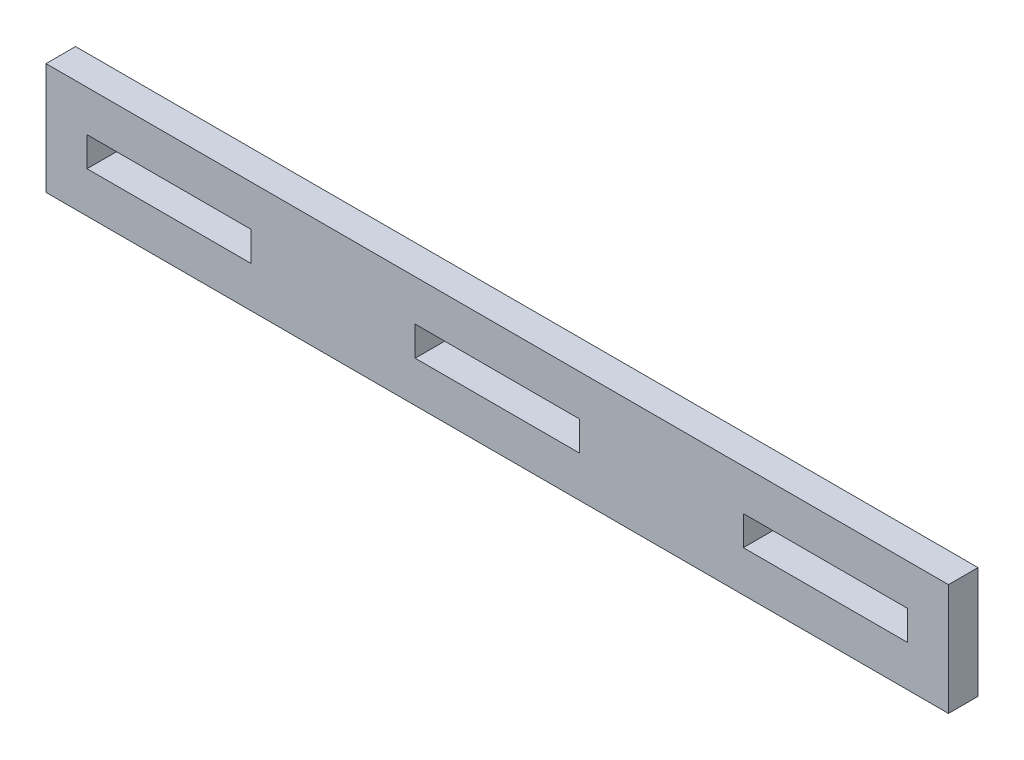
ISO-10303-21;
HEADER;
FILE_DESCRIPTION(('STEP AP214'),'2;1');
FILE_NAME('part.step','',(''),(''),'','','');
FILE_SCHEMA(('AUTOMOTIVE_DESIGN { 1 0 10303 214 1 1 1 1 }'));
ENDSEC;
DATA;
#1=APPLICATION_CONTEXT('core data for automotive mechanical design processes');
#2=APPLICATION_PROTOCOL_DEFINITION('international standard','automotive_design',2000,#1);
#3=PRODUCT_CONTEXT('',#1,'mechanical');
#4=PRODUCT('Part','Part','',(#3));
#5=PRODUCT_RELATED_PRODUCT_CATEGORY('part','',(#4));
#6=PRODUCT_DEFINITION_FORMATION('','',#4);
#7=PRODUCT_DEFINITION_CONTEXT('part definition',#1,'design');
#8=PRODUCT_DEFINITION('design','',#6,#7);
#9=PRODUCT_DEFINITION_SHAPE('','',#8);
#10=(LENGTH_UNIT() NAMED_UNIT(*) SI_UNIT(.MILLI.,.METRE.));
#11=(NAMED_UNIT(*) PLANE_ANGLE_UNIT() SI_UNIT($,.RADIAN.));
#12=(NAMED_UNIT(*) SI_UNIT($,.STERADIAN.) SOLID_ANGLE_UNIT());
#13=UNCERTAINTY_MEASURE_WITH_UNIT(LENGTH_MEASURE(1.E-05),#10,'distance_accuracy_value','');
#14=(GEOMETRIC_REPRESENTATION_CONTEXT(3) GLOBAL_UNCERTAINTY_ASSIGNED_CONTEXT((#13)) GLOBAL_UNIT_ASSIGNED_CONTEXT((#10,
#11,#12)) REPRESENTATION_CONTEXT('',''));
#15=CARTESIAN_POINT('',(0.,0.,0.));
#16=DIRECTION('',(0.,0.,1.));
#17=DIRECTION('',(1.,0.,0.));
#18=AXIS2_PLACEMENT_3D('',#15,#16,#17);
#19=CARTESIAN_POINT('',(0.,0.,4.572));
#20=DIRECTION('',(1.,0.,0.));
#21=DIRECTION('',(0.,0.,-1.));
#22=AXIS2_PLACEMENT_3D('',#19,#20,#21);
#23=PLANE('',#22);
#24=DIRECTION('',(0.,-1.,0.));
#25=VECTOR('',#24,1.);
#26=CARTESIAN_POINT('',(0.,0.,0.));
#27=LINE('',#26,#25);
#28=CARTESIAN_POINT('',(0.,17.272,0.));
#29=VERTEX_POINT('',#28);
#30=CARTESIAN_POINT('',(0.,0.,0.));
#31=VERTEX_POINT('',#30);
#32=EDGE_CURVE('E182',#29,#31,#27,.T.);
#33=ORIENTED_EDGE('',*,*,#32,.T.);
#34=DIRECTION('',(0.,0.,-1.));
#35=VECTOR('',#34,1.);
#36=CARTESIAN_POINT('',(0.,0.,4.572));
#37=LINE('',#36,#35);
#38=CARTESIAN_POINT('',(0.,0.,4.572));
#39=VERTEX_POINT('',#38);
#40=EDGE_CURVE('E11',#39,#31,#37,.T.);
#41=ORIENTED_EDGE('',*,*,#40,.F.);
#42=DIRECTION('',(0.,-1.,0.));
#43=VECTOR('',#42,1.);
#44=CARTESIAN_POINT('',(0.,0.,4.572));
#45=LINE('',#44,#43);
#46=CARTESIAN_POINT('',(0.,17.272,4.572));
#47=VERTEX_POINT('',#46);
#48=EDGE_CURVE('E247',#47,#39,#45,.T.);
#49=ORIENTED_EDGE('',*,*,#48,.F.);
#50=DIRECTION('',(0.,0.,-1.));
#51=VECTOR('',#50,1.);
#52=CARTESIAN_POINT('',(0.,17.272,4.572));
#53=LINE('',#52,#51);
#54=EDGE_CURVE('E257',#47,#29,#53,.T.);
#55=ORIENTED_EDGE('',*,*,#54,.T.);
#56=EDGE_LOOP('',(#33,#41,#49,#55));
#57=FACE_BOUND('',#56,.T.);
#58=ADVANCED_FACE('F33',(#57),#23,.F.);
#59=CARTESIAN_POINT('',(0.,0.,4.572));
#60=DIRECTION('',(0.,1.,0.));
#61=DIRECTION('',(0.,0.,1.));
#62=AXIS2_PLACEMENT_3D('',#59,#60,#61);
#63=PLANE('',#62);
#64=DIRECTION('',(1.,0.,0.));
#65=VECTOR('',#64,1.);
#66=CARTESIAN_POINT('',(0.,0.,0.));
#67=LINE('',#66,#65);
#68=CARTESIAN_POINT('',(139.7,0.,0.));
#69=VERTEX_POINT('',#68);
#70=EDGE_CURVE('E260',#31,#69,#67,.T.);
#71=ORIENTED_EDGE('',*,*,#70,.T.);
#72=DIRECTION('',(0.,0.,-1.));
#73=VECTOR('',#72,1.);
#74=CARTESIAN_POINT('',(139.7,0.,4.572));
#75=LINE('',#74,#73);
#76=CARTESIAN_POINT('',(139.7,0.,4.572));
#77=VERTEX_POINT('',#76);
#78=EDGE_CURVE('E40',#77,#69,#75,.T.);
#79=ORIENTED_EDGE('',*,*,#78,.F.);
#80=DIRECTION('',(1.,0.,0.));
#81=VECTOR('',#80,1.);
#82=CARTESIAN_POINT('',(0.,0.,4.572));
#83=LINE('',#82,#81);
#84=EDGE_CURVE('E250',#39,#77,#83,.T.);
#85=ORIENTED_EDGE('',*,*,#84,.F.);
#86=ORIENTED_EDGE('',*,*,#40,.T.);
#87=EDGE_LOOP('',(#71,#79,#85,#86));
#88=FACE_BOUND('',#87,.T.);
#89=ADVANCED_FACE('F289',(#88),#63,.F.);
#90=CARTESIAN_POINT('',(139.7,0.,4.572));
#91=DIRECTION('',(-1.,0.,0.));
#92=DIRECTION('',(0.,0.,1.));
#93=AXIS2_PLACEMENT_3D('',#90,#91,#92);
#94=PLANE('',#93);
#95=DIRECTION('',(0.,1.,0.));
#96=VECTOR('',#95,1.);
#97=CARTESIAN_POINT('',(139.7,0.,0.));
#98=LINE('',#97,#96);
#99=CARTESIAN_POINT('',(139.7,17.272,0.));
#100=VERTEX_POINT('',#99);
#101=EDGE_CURVE('E262',#69,#100,#98,.T.);
#102=ORIENTED_EDGE('',*,*,#101,.T.);
#103=DIRECTION('',(0.,0.,-1.));
#104=VECTOR('',#103,1.);
#105=CARTESIAN_POINT('',(139.7,17.272,4.572));
#106=LINE('',#105,#104);
#107=CARTESIAN_POINT('',(139.7,17.272,4.572));
#108=VERTEX_POINT('',#107);
#109=EDGE_CURVE('E267',#108,#100,#106,.T.);
#110=ORIENTED_EDGE('',*,*,#109,.F.);
#111=DIRECTION('',(0.,1.,0.));
#112=VECTOR('',#111,1.);
#113=CARTESIAN_POINT('',(139.7,0.,4.572));
#114=LINE('',#113,#112);
#115=EDGE_CURVE('E253',#77,#108,#114,.T.);
#116=ORIENTED_EDGE('',*,*,#115,.F.);
#117=ORIENTED_EDGE('',*,*,#78,.T.);
#118=EDGE_LOOP('',(#102,#110,#116,#117));
#119=FACE_BOUND('',#118,.T.);
#120=ADVANCED_FACE('F274',(#119),#94,.F.);
#121=CARTESIAN_POINT('',(0.,17.272,4.572));
#122=DIRECTION('',(0.,-1.,0.));
#123=DIRECTION('',(0.,0.,-1.));
#124=AXIS2_PLACEMENT_3D('',#121,#122,#123);
#125=PLANE('',#124);
#126=DIRECTION('',(-1.,0.,0.));
#127=VECTOR('',#126,1.);
#128=CARTESIAN_POINT('',(0.,17.272,0.));
#129=LINE('',#128,#127);
#130=EDGE_CURVE('E251',#100,#29,#129,.T.);
#131=ORIENTED_EDGE('',*,*,#130,.T.);
#132=ORIENTED_EDGE('',*,*,#54,.F.);
#133=DIRECTION('',(-1.,0.,0.));
#134=VECTOR('',#133,1.);
#135=CARTESIAN_POINT('',(0.,17.272,4.572));
#136=LINE('',#135,#134);
#137=EDGE_CURVE('E255',#108,#47,#136,.T.);
#138=ORIENTED_EDGE('',*,*,#137,.F.);
#139=ORIENTED_EDGE('',*,*,#109,.T.);
#140=EDGE_LOOP('',(#131,#132,#138,#139));
#141=FACE_BOUND('',#140,.T.);
#142=ADVANCED_FACE('F282',(#141),#125,.F.);
#143=CARTESIAN_POINT('',(0.,0.,4.572));
#144=DIRECTION('',(0.,0.,-1.));
#145=DIRECTION('',(-1.,0.,0.));
#146=AXIS2_PLACEMENT_3D('',#143,#144,#145);
#147=PLANE('',#146);
#148=DIRECTION('',(1.,0.,0.));
#149=VECTOR('',#148,1.);
#150=CARTESIAN_POINT('',(107.95,6.35,4.572));
#151=LINE('',#150,#149);
#152=CARTESIAN_POINT('',(107.95,6.35,4.572));
#153=VERTEX_POINT('',#152);
#154=CARTESIAN_POINT('',(133.35,6.35,4.572));
#155=VERTEX_POINT('',#154);
#156=EDGE_CURVE('E175',#153,#155,#151,.T.);
#157=ORIENTED_EDGE('',*,*,#156,.F.);
#158=DIRECTION('',(0.,-1.,0.));
#159=VECTOR('',#158,1.);
#160=CARTESIAN_POINT('',(107.95,10.922,4.572));
#161=LINE('',#160,#159);
#162=CARTESIAN_POINT('',(107.95,10.922,4.572));
#163=VERTEX_POINT('',#162);
#164=EDGE_CURVE('E47',#163,#153,#161,.T.);
#165=ORIENTED_EDGE('',*,*,#164,.F.);
#166=DIRECTION('',(-1.,0.,0.));
#167=VECTOR('',#166,1.);
#168=CARTESIAN_POINT('',(107.95,10.922,4.572));
#169=LINE('',#168,#167);
#170=CARTESIAN_POINT('',(133.35,10.922,4.572));
#171=VERTEX_POINT('',#170);
#172=EDGE_CURVE('E166',#171,#163,#169,.T.);
#173=ORIENTED_EDGE('',*,*,#172,.F.);
#174=DIRECTION('',(0.,1.,0.));
#175=VECTOR('',#174,1.);
#176=CARTESIAN_POINT('',(133.35,10.922,4.572));
#177=LINE('',#176,#175);
#178=EDGE_CURVE('E169',#155,#171,#177,.T.);
#179=ORIENTED_EDGE('',*,*,#178,.F.);
#180=EDGE_LOOP('',(#157,#165,#173,#179));
#181=FACE_BOUND('',#180,.T.);
#182=DIRECTION('',(-1.,0.,0.));
#183=VECTOR('',#182,1.);
#184=CARTESIAN_POINT('',(82.55,10.922,4.572));
#185=LINE('',#184,#183);
#186=CARTESIAN_POINT('',(82.55,10.922,4.572));
#187=VERTEX_POINT('',#186);
#188=CARTESIAN_POINT('',(57.15,10.922,4.572));
#189=VERTEX_POINT('',#188);
#190=EDGE_CURVE('E201',#187,#189,#185,.T.);
#191=ORIENTED_EDGE('',*,*,#190,.F.);
#192=DIRECTION('',(0.,1.,0.));
#193=VECTOR('',#192,1.);
#194=CARTESIAN_POINT('',(82.55,10.922,4.572));
#195=LINE('',#194,#193);
#196=CARTESIAN_POINT('',(82.55,6.35,4.572));
#197=VERTEX_POINT('',#196);
#198=EDGE_CURVE('E55',#197,#187,#195,.T.);
#199=ORIENTED_EDGE('',*,*,#198,.F.);
#200=DIRECTION('',(1.,0.,0.));
#201=VECTOR('',#200,1.);
#202=CARTESIAN_POINT('',(82.55,6.35,4.572));
#203=LINE('',#202,#201);
#204=CARTESIAN_POINT('',(57.15,6.34999999999999,4.572));
#205=VERTEX_POINT('',#204);
#206=EDGE_CURVE('E190',#205,#197,#203,.T.);
#207=ORIENTED_EDGE('',*,*,#206,.F.);
#208=DIRECTION('',(0.,-1.,0.));
#209=VECTOR('',#208,1.);
#210=CARTESIAN_POINT('',(57.15,10.922,4.572));
#211=LINE('',#210,#209);
#212=EDGE_CURVE('E205',#189,#205,#211,.T.);
#213=ORIENTED_EDGE('',*,*,#212,.F.);
#214=EDGE_LOOP('',(#191,#199,#207,#213));
#215=FACE_BOUND('',#214,.T.);
#216=DIRECTION('',(-1.,0.,0.));
#217=VECTOR('',#216,1.);
#218=CARTESIAN_POINT('',(31.75,10.922,4.572));
#219=LINE('',#218,#217);
#220=CARTESIAN_POINT('',(31.75,10.922,4.572));
#221=VERTEX_POINT('',#220);
#222=CARTESIAN_POINT('',(6.34999999999999,10.922,4.572));
#223=VERTEX_POINT('',#222);
#224=EDGE_CURVE('E232',#221,#223,#219,.T.);
#225=ORIENTED_EDGE('',*,*,#224,.F.);
#226=DIRECTION('',(0.,1.,0.));
#227=VECTOR('',#226,1.);
#228=CARTESIAN_POINT('',(31.75,10.922,4.572));
#229=LINE('',#228,#227);
#230=CARTESIAN_POINT('',(31.75,6.35,4.572));
#231=VERTEX_POINT('',#230);
#232=EDGE_CURVE('E230',#231,#221,#229,.T.);
#233=ORIENTED_EDGE('',*,*,#232,.F.);
#234=DIRECTION('',(1.,0.,0.));
#235=VECTOR('',#234,1.);
#236=CARTESIAN_POINT('',(31.75,6.35,4.572));
#237=LINE('',#236,#235);
#238=CARTESIAN_POINT('',(6.34999999999999,6.35,4.572));
#239=VERTEX_POINT('',#238);
#240=EDGE_CURVE('E220',#239,#231,#237,.T.);
#241=ORIENTED_EDGE('',*,*,#240,.F.);
#242=DIRECTION('',(0.,-1.,0.));
#243=VECTOR('',#242,1.);
#244=CARTESIAN_POINT('',(6.34999999999999,10.922,4.572));
#245=LINE('',#244,#243);
#246=EDGE_CURVE('E235',#223,#239,#245,.T.);
#247=ORIENTED_EDGE('',*,*,#246,.F.);
#248=EDGE_LOOP('',(#225,#233,#241,#247));
#249=FACE_BOUND('',#248,.T.);
#250=ORIENTED_EDGE('',*,*,#48,.T.);
#251=ORIENTED_EDGE('',*,*,#84,.T.);
#252=ORIENTED_EDGE('',*,*,#115,.T.);
#253=ORIENTED_EDGE('',*,*,#137,.T.);
#254=EDGE_LOOP('',(#250,#251,#252,#253));
#255=FACE_BOUND('',#254,.T.);
#256=ADVANCED_FACE('F288',(#181,#215,#249,#255),#147,.F.);
#257=CARTESIAN_POINT('',(0.,0.,0.));
#258=DIRECTION('',(0.,0.,-1.));
#259=DIRECTION('',(-1.,0.,0.));
#260=AXIS2_PLACEMENT_3D('',#257,#258,#259);
#261=PLANE('',#260);
#262=DIRECTION('',(0.,-1.,0.));
#263=VECTOR('',#262,1.);
#264=CARTESIAN_POINT('',(107.95,10.922,0.));
#265=LINE('',#264,#263);
#266=CARTESIAN_POINT('',(107.95,10.922,0.));
#267=VERTEX_POINT('',#266);
#268=CARTESIAN_POINT('',(107.95,6.35,0.));
#269=VERTEX_POINT('',#268);
#270=EDGE_CURVE('E147',#267,#269,#265,.T.);
#271=ORIENTED_EDGE('',*,*,#270,.T.);
#272=DIRECTION('',(1.,0.,0.));
#273=VECTOR('',#272,1.);
#274=CARTESIAN_POINT('',(107.95,6.35,0.));
#275=LINE('',#274,#273);
#276=CARTESIAN_POINT('',(133.35,6.35,0.));
#277=VERTEX_POINT('',#276);
#278=EDGE_CURVE('E157',#269,#277,#275,.T.);
#279=ORIENTED_EDGE('',*,*,#278,.T.);
#280=DIRECTION('',(0.,1.,0.));
#281=VECTOR('',#280,1.);
#282=CARTESIAN_POINT('',(133.35,10.922,0.));
#283=LINE('',#282,#281);
#284=CARTESIAN_POINT('',(133.35,10.922,0.));
#285=VERTEX_POINT('',#284);
#286=EDGE_CURVE('E161',#277,#285,#283,.T.);
#287=ORIENTED_EDGE('',*,*,#286,.T.);
#288=DIRECTION('',(-1.,0.,0.));
#289=VECTOR('',#288,1.);
#290=CARTESIAN_POINT('',(107.95,10.922,0.));
#291=LINE('',#290,#289);
#292=EDGE_CURVE('E153',#285,#267,#291,.T.);
#293=ORIENTED_EDGE('',*,*,#292,.T.);
#294=EDGE_LOOP('',(#271,#279,#287,#293));
#295=FACE_BOUND('',#294,.T.);
#296=DIRECTION('',(0.,1.,0.));
#297=VECTOR('',#296,1.);
#298=CARTESIAN_POINT('',(82.55,10.922,0.));
#299=LINE('',#298,#297);
#300=CARTESIAN_POINT('',(82.55,6.35,0.));
#301=VERTEX_POINT('',#300);
#302=CARTESIAN_POINT('',(82.55,10.922,0.));
#303=VERTEX_POINT('',#302);
#304=EDGE_CURVE('E186',#301,#303,#299,.T.);
#305=ORIENTED_EDGE('',*,*,#304,.T.);
#306=DIRECTION('',(-1.,0.,0.));
#307=VECTOR('',#306,1.);
#308=CARTESIAN_POINT('',(82.55,10.922,0.));
#309=LINE('',#308,#307);
#310=CARTESIAN_POINT('',(57.15,10.922,0.));
#311=VERTEX_POINT('',#310);
#312=EDGE_CURVE('E189',#303,#311,#309,.T.);
#313=ORIENTED_EDGE('',*,*,#312,.T.);
#314=DIRECTION('',(0.,-1.,0.));
#315=VECTOR('',#314,1.);
#316=CARTESIAN_POINT('',(57.15,10.922,0.));
#317=LINE('',#316,#315);
#318=CARTESIAN_POINT('',(57.15,6.34999999999999,0.));
#319=VERTEX_POINT('',#318);
#320=EDGE_CURVE('E193',#311,#319,#317,.T.);
#321=ORIENTED_EDGE('',*,*,#320,.T.);
#322=DIRECTION('',(1.,0.,0.));
#323=VECTOR('',#322,1.);
#324=CARTESIAN_POINT('',(82.55,6.35,0.));
#325=LINE('',#324,#323);
#326=EDGE_CURVE('E196',#319,#301,#325,.T.);
#327=ORIENTED_EDGE('',*,*,#326,.T.);
#328=EDGE_LOOP('',(#305,#313,#321,#327));
#329=FACE_BOUND('',#328,.T.);
#330=DIRECTION('',(0.,1.,0.));
#331=VECTOR('',#330,1.);
#332=CARTESIAN_POINT('',(31.75,10.922,0.));
#333=LINE('',#332,#331);
#334=CARTESIAN_POINT('',(31.75,6.35,0.));
#335=VERTEX_POINT('',#334);
#336=CARTESIAN_POINT('',(31.75,10.922,0.));
#337=VERTEX_POINT('',#336);
#338=EDGE_CURVE('E216',#335,#337,#333,.T.);
#339=ORIENTED_EDGE('',*,*,#338,.T.);
#340=DIRECTION('',(-1.,0.,0.));
#341=VECTOR('',#340,1.);
#342=CARTESIAN_POINT('',(31.75,10.922,0.));
#343=LINE('',#342,#341);
#344=CARTESIAN_POINT('',(6.34999999999999,10.922,0.));
#345=VERTEX_POINT('',#344);
#346=EDGE_CURVE('E219',#337,#345,#343,.T.);
#347=ORIENTED_EDGE('',*,*,#346,.T.);
#348=DIRECTION('',(0.,-1.,0.));
#349=VECTOR('',#348,1.);
#350=CARTESIAN_POINT('',(6.34999999999999,10.922,0.));
#351=LINE('',#350,#349);
#352=CARTESIAN_POINT('',(6.34999999999999,6.35,0.));
#353=VERTEX_POINT('',#352);
#354=EDGE_CURVE('E223',#345,#353,#351,.T.);
#355=ORIENTED_EDGE('',*,*,#354,.T.);
#356=DIRECTION('',(1.,0.,0.));
#357=VECTOR('',#356,1.);
#358=CARTESIAN_POINT('',(31.75,6.35,0.));
#359=LINE('',#358,#357);
#360=EDGE_CURVE('E226',#353,#335,#359,.T.);
#361=ORIENTED_EDGE('',*,*,#360,.T.);
#362=EDGE_LOOP('',(#339,#347,#355,#361));
#363=FACE_BOUND('',#362,.T.);
#364=ORIENTED_EDGE('',*,*,#32,.F.);
#365=ORIENTED_EDGE('',*,*,#130,.F.);
#366=ORIENTED_EDGE('',*,*,#101,.F.);
#367=ORIENTED_EDGE('',*,*,#70,.F.);
#368=EDGE_LOOP('',(#364,#365,#366,#367));
#369=FACE_BOUND('',#368,.T.);
#370=ADVANCED_FACE('F163',(#295,#329,#363,#369),#261,.T.);
#371=CARTESIAN_POINT('',(31.75,10.922,0.));
#372=DIRECTION('',(1.,0.,0.));
#373=DIRECTION('',(0.,0.,-1.));
#374=AXIS2_PLACEMENT_3D('',#371,#372,#373);
#375=PLANE('',#374);
#376=ORIENTED_EDGE('',*,*,#232,.T.);
#377=DIRECTION('',(0.,0.,1.));
#378=VECTOR('',#377,1.);
#379=CARTESIAN_POINT('',(31.75,10.922,0.));
#380=LINE('',#379,#378);
#381=EDGE_CURVE('E229',#337,#221,#380,.T.);
#382=ORIENTED_EDGE('',*,*,#381,.F.);
#383=ORIENTED_EDGE('',*,*,#338,.F.);
#384=DIRECTION('',(0.,0.,1.));
#385=VECTOR('',#384,1.);
#386=CARTESIAN_POINT('',(31.75,6.35,0.));
#387=LINE('',#386,#385);
#388=EDGE_CURVE('E202',#335,#231,#387,.T.);
#389=ORIENTED_EDGE('',*,*,#388,.T.);
#390=EDGE_LOOP('',(#376,#382,#383,#389));
#391=FACE_BOUND('',#390,.T.);
#392=ADVANCED_FACE('F301',(#391),#375,.F.);
#393=CARTESIAN_POINT('',(31.75,6.35,0.));
#394=DIRECTION('',(0.,-1.,0.));
#395=DIRECTION('',(1.,0.,0.));
#396=AXIS2_PLACEMENT_3D('',#393,#394,#395);
#397=PLANE('',#396);
#398=ORIENTED_EDGE('',*,*,#240,.T.);
#399=ORIENTED_EDGE('',*,*,#388,.F.);
#400=ORIENTED_EDGE('',*,*,#360,.F.);
#401=DIRECTION('',(0.,0.,1.));
#402=VECTOR('',#401,1.);
#403=CARTESIAN_POINT('',(6.34999999999999,6.35,0.));
#404=LINE('',#403,#402);
#405=EDGE_CURVE('E241',#353,#239,#404,.T.);
#406=ORIENTED_EDGE('',*,*,#405,.T.);
#407=EDGE_LOOP('',(#398,#399,#400,#406));
#408=FACE_BOUND('',#407,.T.);
#409=ADVANCED_FACE('F307',(#408),#397,.F.);
#410=CARTESIAN_POINT('',(6.34999999999999,10.922,0.));
#411=DIRECTION('',(-1.,0.,0.));
#412=DIRECTION('',(0.,0.,1.));
#413=AXIS2_PLACEMENT_3D('',#410,#411,#412);
#414=PLANE('',#413);
#415=ORIENTED_EDGE('',*,*,#246,.T.);
#416=ORIENTED_EDGE('',*,*,#405,.F.);
#417=ORIENTED_EDGE('',*,*,#354,.F.);
#418=DIRECTION('',(0.,0.,1.));
#419=VECTOR('',#418,1.);
#420=CARTESIAN_POINT('',(6.34999999999999,10.922,0.));
#421=LINE('',#420,#419);
#422=EDGE_CURVE('E243',#345,#223,#421,.T.);
#423=ORIENTED_EDGE('',*,*,#422,.T.);
#424=EDGE_LOOP('',(#415,#416,#417,#423));
#425=FACE_BOUND('',#424,.T.);
#426=ADVANCED_FACE('F313',(#425),#414,.F.);
#427=CARTESIAN_POINT('',(31.75,10.922,0.));
#428=DIRECTION('',(0.,1.,0.));
#429=DIRECTION('',(-1.,0.,0.));
#430=AXIS2_PLACEMENT_3D('',#427,#428,#429);
#431=PLANE('',#430);
#432=ORIENTED_EDGE('',*,*,#224,.T.);
#433=ORIENTED_EDGE('',*,*,#422,.F.);
#434=ORIENTED_EDGE('',*,*,#346,.F.);
#435=ORIENTED_EDGE('',*,*,#381,.T.);
#436=EDGE_LOOP('',(#432,#433,#434,#435));
#437=FACE_BOUND('',#436,.T.);
#438=ADVANCED_FACE('F309',(#437),#431,.F.);
#439=CARTESIAN_POINT('',(82.55,10.922,0.));
#440=DIRECTION('',(1.,0.,0.));
#441=DIRECTION('',(0.,0.,-1.));
#442=AXIS2_PLACEMENT_3D('',#439,#440,#441);
#443=PLANE('',#442);
#444=ORIENTED_EDGE('',*,*,#198,.T.);
#445=DIRECTION('',(0.,0.,1.));
#446=VECTOR('',#445,1.);
#447=CARTESIAN_POINT('',(82.55,10.922,0.));
#448=LINE('',#447,#446);
#449=EDGE_CURVE('E199',#303,#187,#448,.T.);
#450=ORIENTED_EDGE('',*,*,#449,.F.);
#451=ORIENTED_EDGE('',*,*,#304,.F.);
#452=DIRECTION('',(0.,0.,1.));
#453=VECTOR('',#452,1.);
#454=CARTESIAN_POINT('',(82.55,6.35,0.));
#455=LINE('',#454,#453);
#456=EDGE_CURVE('E176',#301,#197,#455,.T.);
#457=ORIENTED_EDGE('',*,*,#456,.T.);
#458=EDGE_LOOP('',(#444,#450,#451,#457));
#459=FACE_BOUND('',#458,.T.);
#460=ADVANCED_FACE('F312',(#459),#443,.F.);
#461=CARTESIAN_POINT('',(82.55,6.35,0.));
#462=DIRECTION('',(0.,-1.,0.));
#463=DIRECTION('',(1.,0.,0.));
#464=AXIS2_PLACEMENT_3D('',#461,#462,#463);
#465=PLANE('',#464);
#466=ORIENTED_EDGE('',*,*,#206,.T.);
#467=ORIENTED_EDGE('',*,*,#456,.F.);
#468=ORIENTED_EDGE('',*,*,#326,.F.);
#469=DIRECTION('',(0.,0.,1.));
#470=VECTOR('',#469,1.);
#471=CARTESIAN_POINT('',(57.15,6.34999999999999,0.));
#472=LINE('',#471,#470);
#473=EDGE_CURVE('E211',#319,#205,#472,.T.);
#474=ORIENTED_EDGE('',*,*,#473,.T.);
#475=EDGE_LOOP('',(#466,#467,#468,#474));
#476=FACE_BOUND('',#475,.T.);
#477=ADVANCED_FACE('F323',(#476),#465,.F.);
#478=CARTESIAN_POINT('',(57.15,10.922,0.));
#479=DIRECTION('',(-1.,0.,0.));
#480=DIRECTION('',(0.,0.,1.));
#481=AXIS2_PLACEMENT_3D('',#478,#479,#480);
#482=PLANE('',#481);
#483=ORIENTED_EDGE('',*,*,#212,.T.);
#484=ORIENTED_EDGE('',*,*,#473,.F.);
#485=ORIENTED_EDGE('',*,*,#320,.F.);
#486=DIRECTION('',(0.,0.,1.));
#487=VECTOR('',#486,1.);
#488=CARTESIAN_POINT('',(57.15,10.922,0.));
#489=LINE('',#488,#487);
#490=EDGE_CURVE('E213',#311,#189,#489,.T.);
#491=ORIENTED_EDGE('',*,*,#490,.T.);
#492=EDGE_LOOP('',(#483,#484,#485,#491));
#493=FACE_BOUND('',#492,.T.);
#494=ADVANCED_FACE('F327',(#493),#482,.F.);
#495=CARTESIAN_POINT('',(82.55,10.922,0.));
#496=DIRECTION('',(0.,1.,0.));
#497=DIRECTION('',(-1.,0.,0.));
#498=AXIS2_PLACEMENT_3D('',#495,#496,#497);
#499=PLANE('',#498);
#500=ORIENTED_EDGE('',*,*,#190,.T.);
#501=ORIENTED_EDGE('',*,*,#490,.F.);
#502=ORIENTED_EDGE('',*,*,#312,.F.);
#503=ORIENTED_EDGE('',*,*,#449,.T.);
#504=EDGE_LOOP('',(#500,#501,#502,#503));
#505=FACE_BOUND('',#504,.T.);
#506=ADVANCED_FACE('F324',(#505),#499,.F.);
#507=CARTESIAN_POINT('',(107.95,10.922,0.));
#508=DIRECTION('',(-1.,0.,0.));
#509=DIRECTION('',(0.,0.,1.));
#510=AXIS2_PLACEMENT_3D('',#507,#508,#509);
#511=PLANE('',#510);
#512=ORIENTED_EDGE('',*,*,#164,.T.);
#513=DIRECTION('',(0.,0.,1.));
#514=VECTOR('',#513,1.);
#515=CARTESIAN_POINT('',(107.95,6.35,0.));
#516=LINE('',#515,#514);
#517=EDGE_CURVE('E143',#269,#153,#516,.T.);
#518=ORIENTED_EDGE('',*,*,#517,.F.);
#519=ORIENTED_EDGE('',*,*,#270,.F.);
#520=DIRECTION('',(0.,0.,1.));
#521=VECTOR('',#520,1.);
#522=CARTESIAN_POINT('',(107.95,10.922,0.));
#523=LINE('',#522,#521);
#524=EDGE_CURVE('E180',#267,#163,#523,.T.);
#525=ORIENTED_EDGE('',*,*,#524,.T.);
#526=EDGE_LOOP('',(#512,#518,#519,#525));
#527=FACE_BOUND('',#526,.T.);
#528=ADVANCED_FACE('F145',(#527),#511,.F.);
#529=CARTESIAN_POINT('',(107.95,10.922,0.));
#530=DIRECTION('',(0.,1.,0.));
#531=DIRECTION('',(0.,0.,1.));
#532=AXIS2_PLACEMENT_3D('',#529,#530,#531);
#533=PLANE('',#532);
#534=ORIENTED_EDGE('',*,*,#172,.T.);
#535=ORIENTED_EDGE('',*,*,#524,.F.);
#536=ORIENTED_EDGE('',*,*,#292,.F.);
#537=DIRECTION('',(0.,0.,1.));
#538=VECTOR('',#537,1.);
#539=CARTESIAN_POINT('',(133.35,10.922,0.));
#540=LINE('',#539,#538);
#541=EDGE_CURVE('E183',#285,#171,#540,.T.);
#542=ORIENTED_EDGE('',*,*,#541,.T.);
#543=EDGE_LOOP('',(#534,#535,#536,#542));
#544=FACE_BOUND('',#543,.T.);
#545=ADVANCED_FACE('F337',(#544),#533,.F.);
#546=CARTESIAN_POINT('',(133.35,10.922,0.));
#547=DIRECTION('',(1.,0.,0.));
#548=DIRECTION('',(0.,0.,-1.));
#549=AXIS2_PLACEMENT_3D('',#546,#547,#548);
#550=PLANE('',#549);
#551=ORIENTED_EDGE('',*,*,#178,.T.);
#552=ORIENTED_EDGE('',*,*,#541,.F.);
#553=ORIENTED_EDGE('',*,*,#286,.F.);
#554=DIRECTION('',(0.,0.,1.));
#555=VECTOR('',#554,1.);
#556=CARTESIAN_POINT('',(133.35,6.35,0.));
#557=LINE('',#556,#555);
#558=EDGE_CURVE('E152',#277,#155,#557,.T.);
#559=ORIENTED_EDGE('',*,*,#558,.T.);
#560=EDGE_LOOP('',(#551,#552,#553,#559));
#561=FACE_BOUND('',#560,.T.);
#562=ADVANCED_FACE('F340',(#561),#550,.F.);
#563=CARTESIAN_POINT('',(107.95,6.35,0.));
#564=DIRECTION('',(0.,-1.,0.));
#565=DIRECTION('',(0.,0.,-1.));
#566=AXIS2_PLACEMENT_3D('',#563,#564,#565);
#567=PLANE('',#566);
#568=ORIENTED_EDGE('',*,*,#156,.T.);
#569=ORIENTED_EDGE('',*,*,#558,.F.);
#570=ORIENTED_EDGE('',*,*,#278,.F.);
#571=ORIENTED_EDGE('',*,*,#517,.T.);
#572=EDGE_LOOP('',(#568,#569,#570,#571));
#573=FACE_BOUND('',#572,.T.);
#574=ADVANCED_FACE('F158',(#573),#567,.F.);
#575=CLOSED_SHELL('',(#58,#89,#120,#142,#256,#370,#392,#409,#426,#438,#460,#477,#494,#506,#528,
#545,#562,#574));
#576=MANIFOLD_SOLID_BREP('B2',#575);
#577=ADVANCED_BREP_SHAPE_REPRESENTATION('',(#18,#576),#14);
#578=SHAPE_DEFINITION_REPRESENTATION(#9,#577);
ENDSEC;
END-ISO-10303-21;
